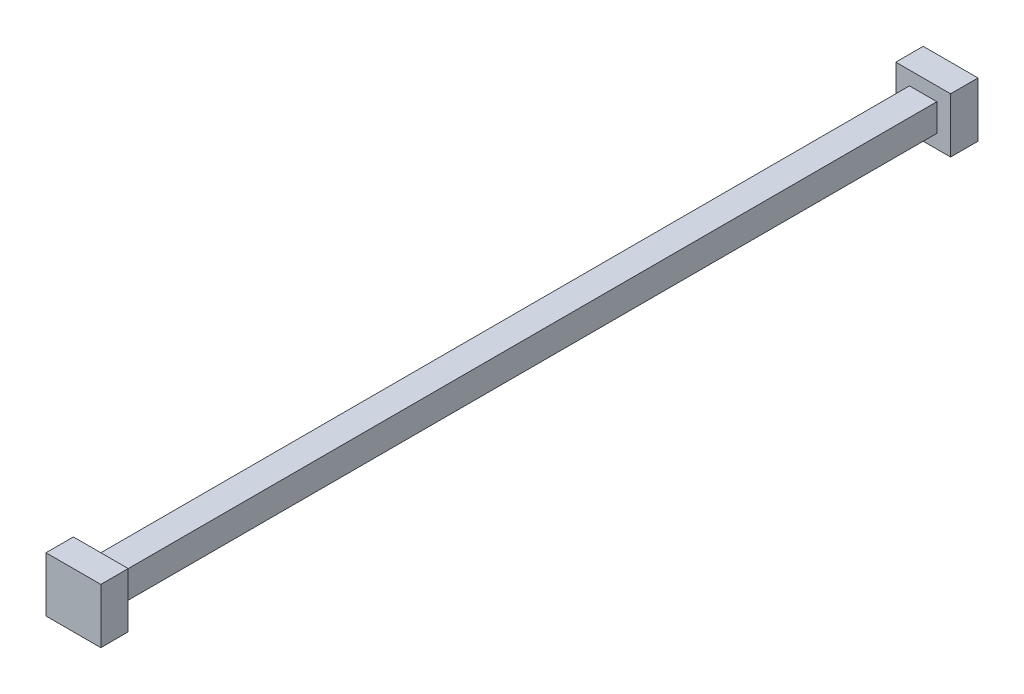
ISO-10303-21;
HEADER;
FILE_DESCRIPTION(('STEP AP214'),'2;1');
FILE_NAME('part.step','',(''),(''),'','','');
FILE_SCHEMA(('AUTOMOTIVE_DESIGN { 1 0 10303 214 1 1 1 1 }'));
ENDSEC;
DATA;
#1=APPLICATION_CONTEXT('core data for automotive mechanical design processes');
#2=APPLICATION_PROTOCOL_DEFINITION('international standard','automotive_design',2000,#1);
#3=PRODUCT_CONTEXT('',#1,'mechanical');
#4=PRODUCT('Part','Part','',(#3));
#5=PRODUCT_RELATED_PRODUCT_CATEGORY('part','',(#4));
#6=PRODUCT_DEFINITION_FORMATION('','',#4);
#7=PRODUCT_DEFINITION_CONTEXT('part definition',#1,'design');
#8=PRODUCT_DEFINITION('design','',#6,#7);
#9=PRODUCT_DEFINITION_SHAPE('','',#8);
#10=(LENGTH_UNIT() NAMED_UNIT(*) SI_UNIT(.MILLI.,.METRE.));
#11=(NAMED_UNIT(*) PLANE_ANGLE_UNIT() SI_UNIT($,.RADIAN.));
#12=(NAMED_UNIT(*) SI_UNIT($,.STERADIAN.) SOLID_ANGLE_UNIT());
#13=UNCERTAINTY_MEASURE_WITH_UNIT(LENGTH_MEASURE(1.E-05),#10,'distance_accuracy_value','');
#14=(GEOMETRIC_REPRESENTATION_CONTEXT(3) GLOBAL_UNCERTAINTY_ASSIGNED_CONTEXT((#13)) GLOBAL_UNIT_ASSIGNED_CONTEXT((#10,
#11,#12)) REPRESENTATION_CONTEXT('',''));
#15=CARTESIAN_POINT('',(0.,0.,0.));
#16=DIRECTION('',(0.,0.,1.));
#17=DIRECTION('',(1.,0.,0.));
#18=AXIS2_PLACEMENT_3D('',#15,#16,#17);
#19=CARTESIAN_POINT('',(5.,-5.,300.));
#20=DIRECTION('',(-1.,0.,0.));
#21=DIRECTION('',(0.,0.,1.));
#22=AXIS2_PLACEMENT_3D('',#19,#20,#21);
#23=PLANE('',#22);
#24=DIRECTION('',(0.,1.,0.));
#25=VECTOR('',#24,1.);
#26=CARTESIAN_POINT('',(5.,-5.,0.));
#27=LINE('',#26,#25);
#28=CARTESIAN_POINT('',(5.,-5.,0.));
#29=VERTEX_POINT('',#28);
#30=CARTESIAN_POINT('',(5.,5.,0.));
#31=VERTEX_POINT('',#30);
#32=EDGE_CURVE('E180',#29,#31,#27,.T.);
#33=ORIENTED_EDGE('',*,*,#32,.T.);
#34=DIRECTION('',(0.,0.,-1.));
#35=VECTOR('',#34,1.);
#36=CARTESIAN_POINT('',(5.,5.,300.));
#37=LINE('',#36,#35);
#38=CARTESIAN_POINT('',(5.,5.,300.));
#39=VERTEX_POINT('',#38);
#40=EDGE_CURVE('E11',#39,#31,#37,.T.);
#41=ORIENTED_EDGE('',*,*,#40,.F.);
#42=DIRECTION('',(0.,1.,0.));
#43=VECTOR('',#42,1.);
#44=CARTESIAN_POINT('',(5.,-5.,300.));
#45=LINE('',#44,#43);
#46=CARTESIAN_POINT('',(5.,-5.,300.));
#47=VERTEX_POINT('',#46);
#48=EDGE_CURVE('E181',#47,#39,#45,.T.);
#49=ORIENTED_EDGE('',*,*,#48,.F.);
#50=DIRECTION('',(0.,0.,-1.));
#51=VECTOR('',#50,1.);
#52=CARTESIAN_POINT('',(5.,-5.,300.));
#53=LINE('',#52,#51);
#54=EDGE_CURVE('E194',#47,#29,#53,.T.);
#55=ORIENTED_EDGE('',*,*,#54,.T.);
#56=EDGE_LOOP('',(#33,#41,#49,#55));
#57=FACE_BOUND('',#56,.T.);
#58=ADVANCED_FACE('F35',(#57),#23,.F.);
#59=CARTESIAN_POINT('',(-5.,5.,300.));
#60=DIRECTION('',(0.,-1.,0.));
#61=DIRECTION('',(0.,0.,-1.));
#62=AXIS2_PLACEMENT_3D('',#59,#60,#61);
#63=PLANE('',#62);
#64=DIRECTION('',(-1.,0.,0.));
#65=VECTOR('',#64,1.);
#66=CARTESIAN_POINT('',(-5.,5.,0.));
#67=LINE('',#66,#65);
#68=CARTESIAN_POINT('',(-5.,5.,0.));
#69=VERTEX_POINT('',#68);
#70=EDGE_CURVE('E197',#31,#69,#67,.T.);
#71=ORIENTED_EDGE('',*,*,#70,.T.);
#72=DIRECTION('',(0.,0.,-1.));
#73=VECTOR('',#72,1.);
#74=CARTESIAN_POINT('',(-5.,5.,300.));
#75=LINE('',#74,#73);
#76=CARTESIAN_POINT('',(-5.,5.,300.));
#77=VERTEX_POINT('',#76);
#78=EDGE_CURVE('E43',#77,#69,#75,.T.);
#79=ORIENTED_EDGE('',*,*,#78,.F.);
#80=DIRECTION('',(-1.,0.,0.));
#81=VECTOR('',#80,1.);
#82=CARTESIAN_POINT('',(-5.,5.,300.));
#83=LINE('',#82,#81);
#84=EDGE_CURVE('E184',#39,#77,#83,.T.);
#85=ORIENTED_EDGE('',*,*,#84,.F.);
#86=ORIENTED_EDGE('',*,*,#40,.T.);
#87=EDGE_LOOP('',(#71,#79,#85,#86));
#88=FACE_BOUND('',#87,.T.);
#89=ADVANCED_FACE('F210',(#88),#63,.F.);
#90=CARTESIAN_POINT('',(-5.,-5.,300.));
#91=DIRECTION('',(1.,0.,0.));
#92=DIRECTION('',(0.,0.,-1.));
#93=AXIS2_PLACEMENT_3D('',#90,#91,#92);
#94=PLANE('',#93);
#95=DIRECTION('',(0.,-1.,0.));
#96=VECTOR('',#95,1.);
#97=CARTESIAN_POINT('',(-5.,-5.,0.));
#98=LINE('',#97,#96);
#99=CARTESIAN_POINT('',(-5.,-5.,0.));
#100=VERTEX_POINT('',#99);
#101=EDGE_CURVE('E200',#69,#100,#98,.T.);
#102=ORIENTED_EDGE('',*,*,#101,.T.);
#103=DIRECTION('',(0.,0.,-1.));
#104=VECTOR('',#103,1.);
#105=CARTESIAN_POINT('',(-5.,-5.,300.));
#106=LINE('',#105,#104);
#107=CARTESIAN_POINT('',(-5.,-5.,300.));
#108=VERTEX_POINT('',#107);
#109=EDGE_CURVE('E50',#108,#100,#106,.T.);
#110=ORIENTED_EDGE('',*,*,#109,.F.);
#111=DIRECTION('',(0.,-1.,0.));
#112=VECTOR('',#111,1.);
#113=CARTESIAN_POINT('',(-5.,-5.,300.));
#114=LINE('',#113,#112);
#115=EDGE_CURVE('E188',#77,#108,#114,.T.);
#116=ORIENTED_EDGE('',*,*,#115,.F.);
#117=ORIENTED_EDGE('',*,*,#78,.T.);
#118=EDGE_LOOP('',(#102,#110,#116,#117));
#119=FACE_BOUND('',#118,.T.);
#120=ADVANCED_FACE('F207',(#119),#94,.F.);
#121=CARTESIAN_POINT('',(-5.,-5.,300.));
#122=DIRECTION('',(0.,1.,0.));
#123=DIRECTION('',(0.,0.,1.));
#124=AXIS2_PLACEMENT_3D('',#121,#122,#123);
#125=PLANE('',#124);
#126=DIRECTION('',(1.,0.,0.));
#127=VECTOR('',#126,1.);
#128=CARTESIAN_POINT('',(-5.,-5.,0.));
#129=LINE('',#128,#127);
#130=EDGE_CURVE('E185',#100,#29,#129,.T.);
#131=ORIENTED_EDGE('',*,*,#130,.T.);
#132=ORIENTED_EDGE('',*,*,#54,.F.);
#133=DIRECTION('',(1.,0.,0.));
#134=VECTOR('',#133,1.);
#135=CARTESIAN_POINT('',(-5.,-5.,300.));
#136=LINE('',#135,#134);
#137=EDGE_CURVE('E191',#108,#47,#136,.T.);
#138=ORIENTED_EDGE('',*,*,#137,.F.);
#139=ORIENTED_EDGE('',*,*,#109,.T.);
#140=EDGE_LOOP('',(#131,#132,#138,#139));
#141=FACE_BOUND('',#140,.T.);
#142=ADVANCED_FACE('F216',(#141),#125,.F.);
#143=CARTESIAN_POINT('',(10.,-10.,310.));
#144=DIRECTION('',(-1.,0.,0.));
#145=DIRECTION('',(0.,0.,1.));
#146=AXIS2_PLACEMENT_3D('',#143,#144,#145);
#147=PLANE('',#146);
#148=DIRECTION('',(0.,1.,0.));
#149=VECTOR('',#148,1.);
#150=CARTESIAN_POINT('',(10.,-10.,300.));
#151=LINE('',#150,#149);
#152=CARTESIAN_POINT('',(10.,-10.,300.));
#153=VERTEX_POINT('',#152);
#154=CARTESIAN_POINT('',(10.,10.,300.));
#155=VERTEX_POINT('',#154);
#156=EDGE_CURVE('E145',#153,#155,#151,.T.);
#157=ORIENTED_EDGE('',*,*,#156,.T.);
#158=DIRECTION('',(0.,0.,-1.));
#159=VECTOR('',#158,1.);
#160=CARTESIAN_POINT('',(10.,10.,310.));
#161=LINE('',#160,#159);
#162=CARTESIAN_POINT('',(10.,10.,310.));
#163=VERTEX_POINT('',#162);
#164=EDGE_CURVE('E177',#163,#155,#161,.T.);
#165=ORIENTED_EDGE('',*,*,#164,.F.);
#166=DIRECTION('',(0.,1.,0.));
#167=VECTOR('',#166,1.);
#168=CARTESIAN_POINT('',(10.,-10.,310.));
#169=LINE('',#168,#167);
#170=CARTESIAN_POINT('',(10.,-10.,310.));
#171=VERTEX_POINT('',#170);
#172=EDGE_CURVE('E154',#171,#163,#169,.T.);
#173=ORIENTED_EDGE('',*,*,#172,.F.);
#174=DIRECTION('',(0.,0.,-1.));
#175=VECTOR('',#174,1.);
#176=CARTESIAN_POINT('',(10.,-10.,310.));
#177=LINE('',#176,#175);
#178=EDGE_CURVE('E163',#171,#153,#177,.T.);
#179=ORIENTED_EDGE('',*,*,#178,.T.);
#180=EDGE_LOOP('',(#157,#165,#173,#179));
#181=FACE_BOUND('',#180,.T.);
#182=ADVANCED_FACE('F229',(#181),#147,.F.);
#183=CARTESIAN_POINT('',(-10.,10.,310.));
#184=DIRECTION('',(0.,-1.,0.));
#185=DIRECTION('',(0.,0.,-1.));
#186=AXIS2_PLACEMENT_3D('',#183,#184,#185);
#187=PLANE('',#186);
#188=DIRECTION('',(-1.,0.,0.));
#189=VECTOR('',#188,1.);
#190=CARTESIAN_POINT('',(-10.,10.,300.));
#191=LINE('',#190,#189);
#192=CARTESIAN_POINT('',(-10.,10.,300.));
#193=VERTEX_POINT('',#192);
#194=EDGE_CURVE('E148',#155,#193,#191,.T.);
#195=ORIENTED_EDGE('',*,*,#194,.T.);
#196=DIRECTION('',(0.,0.,-1.));
#197=VECTOR('',#196,1.);
#198=CARTESIAN_POINT('',(-10.,10.,310.));
#199=LINE('',#198,#197);
#200=CARTESIAN_POINT('',(-10.,10.,310.));
#201=VERTEX_POINT('',#200);
#202=EDGE_CURVE('E174',#201,#193,#199,.T.);
#203=ORIENTED_EDGE('',*,*,#202,.F.);
#204=DIRECTION('',(-1.,0.,0.));
#205=VECTOR('',#204,1.);
#206=CARTESIAN_POINT('',(-10.,10.,310.));
#207=LINE('',#206,#205);
#208=EDGE_CURVE('E157',#163,#201,#207,.T.);
#209=ORIENTED_EDGE('',*,*,#208,.F.);
#210=ORIENTED_EDGE('',*,*,#164,.T.);
#211=EDGE_LOOP('',(#195,#203,#209,#210));
#212=FACE_BOUND('',#211,.T.);
#213=ADVANCED_FACE('F241',(#212),#187,.F.);
#214=CARTESIAN_POINT('',(-10.,-10.,310.));
#215=DIRECTION('',(1.,0.,0.));
#216=DIRECTION('',(0.,0.,-1.));
#217=AXIS2_PLACEMENT_3D('',#214,#215,#216);
#218=PLANE('',#217);
#219=DIRECTION('',(0.,-1.,0.));
#220=VECTOR('',#219,1.);
#221=CARTESIAN_POINT('',(-10.,-10.,300.));
#222=LINE('',#221,#220);
#223=CARTESIAN_POINT('',(-10.,-10.,300.));
#224=VERTEX_POINT('',#223);
#225=EDGE_CURVE('E166',#193,#224,#222,.T.);
#226=ORIENTED_EDGE('',*,*,#225,.T.);
#227=DIRECTION('',(0.,0.,-1.));
#228=VECTOR('',#227,1.);
#229=CARTESIAN_POINT('',(-10.,-10.,310.));
#230=LINE('',#229,#228);
#231=CARTESIAN_POINT('',(-10.,-10.,310.));
#232=VERTEX_POINT('',#231);
#233=EDGE_CURVE('E171',#232,#224,#230,.T.);
#234=ORIENTED_EDGE('',*,*,#233,.F.);
#235=DIRECTION('',(0.,-1.,0.));
#236=VECTOR('',#235,1.);
#237=CARTESIAN_POINT('',(-10.,-10.,310.));
#238=LINE('',#237,#236);
#239=EDGE_CURVE('E160',#201,#232,#238,.T.);
#240=ORIENTED_EDGE('',*,*,#239,.F.);
#241=ORIENTED_EDGE('',*,*,#202,.T.);
#242=EDGE_LOOP('',(#226,#234,#240,#241));
#243=FACE_BOUND('',#242,.T.);
#244=ADVANCED_FACE('F238',(#243),#218,.F.);
#245=CARTESIAN_POINT('',(-10.,-10.,310.));
#246=DIRECTION('',(0.,1.,0.));
#247=DIRECTION('',(0.,0.,1.));
#248=AXIS2_PLACEMENT_3D('',#245,#246,#247);
#249=PLANE('',#248);
#250=DIRECTION('',(1.,0.,0.));
#251=VECTOR('',#250,1.);
#252=CARTESIAN_POINT('',(-10.,-10.,300.));
#253=LINE('',#252,#251);
#254=EDGE_CURVE('E158',#224,#153,#253,.T.);
#255=ORIENTED_EDGE('',*,*,#254,.T.);
#256=ORIENTED_EDGE('',*,*,#178,.F.);
#257=DIRECTION('',(1.,0.,0.));
#258=VECTOR('',#257,1.);
#259=CARTESIAN_POINT('',(-10.,-10.,310.));
#260=LINE('',#259,#258);
#261=EDGE_CURVE('E162',#232,#171,#260,.T.);
#262=ORIENTED_EDGE('',*,*,#261,.F.);
#263=ORIENTED_EDGE('',*,*,#233,.T.);
#264=EDGE_LOOP('',(#255,#256,#262,#263));
#265=FACE_BOUND('',#264,.T.);
#266=ADVANCED_FACE('F234',(#265),#249,.F.);
#267=CARTESIAN_POINT('',(0.,0.,310.));
#268=DIRECTION('',(0.,0.,-1.));
#269=DIRECTION('',(-1.,0.,0.));
#270=AXIS2_PLACEMENT_3D('',#267,#268,#269);
#271=PLANE('',#270);
#272=ORIENTED_EDGE('',*,*,#172,.T.);
#273=ORIENTED_EDGE('',*,*,#208,.T.);
#274=ORIENTED_EDGE('',*,*,#239,.T.);
#275=ORIENTED_EDGE('',*,*,#261,.T.);
#276=EDGE_LOOP('',(#272,#273,#274,#275));
#277=FACE_BOUND('',#276,.T.);
#278=ADVANCED_FACE('F222',(#277),#271,.F.);
#279=CARTESIAN_POINT('',(0.,0.,300.));
#280=DIRECTION('',(0.,0.,-1.));
#281=DIRECTION('',(-1.,0.,0.));
#282=AXIS2_PLACEMENT_3D('',#279,#280,#281);
#283=PLANE('',#282);
#284=ORIENTED_EDGE('',*,*,#137,.T.);
#285=ORIENTED_EDGE('',*,*,#48,.T.);
#286=ORIENTED_EDGE('',*,*,#84,.T.);
#287=ORIENTED_EDGE('',*,*,#115,.T.);
#288=EDGE_LOOP('',(#284,#285,#286,#287));
#289=FACE_BOUND('',#288,.T.);
#290=ORIENTED_EDGE('',*,*,#156,.F.);
#291=ORIENTED_EDGE('',*,*,#254,.F.);
#292=ORIENTED_EDGE('',*,*,#225,.F.);
#293=ORIENTED_EDGE('',*,*,#194,.F.);
#294=EDGE_LOOP('',(#290,#291,#292,#293));
#295=FACE_BOUND('',#294,.T.);
#296=ADVANCED_FACE('F219',(#289,#295),#283,.T.);
#297=CARTESIAN_POINT('',(0.,0.,0.));
#298=DIRECTION('',(0.,0.,1.));
#299=DIRECTION('',(1.,0.,0.));
#300=AXIS2_PLACEMENT_3D('',#297,#298,#299);
#301=PLANE('',#300);
#302=DIRECTION('',(0.,1.,0.));
#303=VECTOR('',#302,1.);
#304=CARTESIAN_POINT('',(-10.,-10.,0.));
#305=LINE('',#304,#303);
#306=CARTESIAN_POINT('',(-10.,-10.,0.));
#307=VERTEX_POINT('',#306);
#308=CARTESIAN_POINT('',(-10.,10.,0.));
#309=VERTEX_POINT('',#308);
#310=EDGE_CURVE('E144',#307,#309,#305,.T.);
#311=ORIENTED_EDGE('',*,*,#310,.F.);
#312=DIRECTION('',(-1.,0.,0.));
#313=VECTOR('',#312,1.);
#314=CARTESIAN_POINT('',(10.,-10.,0.));
#315=LINE('',#314,#313);
#316=CARTESIAN_POINT('',(10.,-10.,0.));
#317=VERTEX_POINT('',#316);
#318=EDGE_CURVE('E140',#317,#307,#315,.T.);
#319=ORIENTED_EDGE('',*,*,#318,.F.);
#320=DIRECTION('',(0.,-1.,0.));
#321=VECTOR('',#320,1.);
#322=CARTESIAN_POINT('',(10.,-10.,0.));
#323=LINE('',#322,#321);
#324=CARTESIAN_POINT('',(10.,10.,0.));
#325=VERTEX_POINT('',#324);
#326=EDGE_CURVE('E366',#325,#317,#323,.T.);
#327=ORIENTED_EDGE('',*,*,#326,.F.);
#328=DIRECTION('',(1.,0.,0.));
#329=VECTOR('',#328,1.);
#330=CARTESIAN_POINT('',(10.,10.,0.));
#331=LINE('',#330,#329);
#332=EDGE_CURVE('E369',#309,#325,#331,.T.);
#333=ORIENTED_EDGE('',*,*,#332,.F.);
#334=EDGE_LOOP('',(#311,#319,#327,#333));
#335=FACE_BOUND('',#334,.T.);
#336=ORIENTED_EDGE('',*,*,#32,.F.);
#337=ORIENTED_EDGE('',*,*,#130,.F.);
#338=ORIENTED_EDGE('',*,*,#101,.F.);
#339=ORIENTED_EDGE('',*,*,#70,.F.);
#340=EDGE_LOOP('',(#336,#337,#338,#339));
#341=FACE_BOUND('',#340,.T.);
#342=ADVANCED_FACE('F213',(#335,#341),#301,.T.);
#343=CARTESIAN_POINT('',(-10.,-10.,-10.));
#344=DIRECTION('',(1.,0.,0.));
#345=DIRECTION('',(0.,0.,-1.));
#346=AXIS2_PLACEMENT_3D('',#343,#344,#345);
#347=PLANE('',#346);
#348=ORIENTED_EDGE('',*,*,#310,.T.);
#349=DIRECTION('',(0.,0.,1.));
#350=VECTOR('',#349,1.);
#351=CARTESIAN_POINT('',(-10.,10.,-10.));
#352=LINE('',#351,#350);
#353=CARTESIAN_POINT('',(-10.,10.,-10.));
#354=VERTEX_POINT('',#353);
#355=EDGE_CURVE('E124',#354,#309,#352,.T.);
#356=ORIENTED_EDGE('',*,*,#355,.F.);
#357=DIRECTION('',(0.,1.,0.));
#358=VECTOR('',#357,1.);
#359=CARTESIAN_POINT('',(-10.,-10.,-10.));
#360=LINE('',#359,#358);
#361=CARTESIAN_POINT('',(-10.,-10.,-10.));
#362=VERTEX_POINT('',#361);
#363=EDGE_CURVE('E131',#362,#354,#360,.T.);
#364=ORIENTED_EDGE('',*,*,#363,.F.);
#365=DIRECTION('',(0.,0.,1.));
#366=VECTOR('',#365,1.);
#367=CARTESIAN_POINT('',(-10.,-10.,-10.));
#368=LINE('',#367,#366);
#369=EDGE_CURVE('E363',#362,#307,#368,.T.);
#370=ORIENTED_EDGE('',*,*,#369,.T.);
#371=EDGE_LOOP('',(#348,#356,#364,#370));
#372=FACE_BOUND('',#371,.T.);
#373=ADVANCED_FACE('F142',(#372),#347,.F.);
#374=CARTESIAN_POINT('',(10.,10.,-10.));
#375=DIRECTION('',(0.,-1.,0.));
#376=DIRECTION('',(0.,0.,-1.));
#377=AXIS2_PLACEMENT_3D('',#374,#375,#376);
#378=PLANE('',#377);
#379=ORIENTED_EDGE('',*,*,#332,.T.);
#380=DIRECTION('',(0.,0.,1.));
#381=VECTOR('',#380,1.);
#382=CARTESIAN_POINT('',(10.,10.,-10.));
#383=LINE('',#382,#381);
#384=CARTESIAN_POINT('',(10.,10.,-10.));
#385=VERTEX_POINT('',#384);
#386=EDGE_CURVE('E127',#385,#325,#383,.T.);
#387=ORIENTED_EDGE('',*,*,#386,.F.);
#388=DIRECTION('',(1.,0.,0.));
#389=VECTOR('',#388,1.);
#390=CARTESIAN_POINT('',(10.,10.,-10.));
#391=LINE('',#390,#389);
#392=EDGE_CURVE('E120',#354,#385,#391,.T.);
#393=ORIENTED_EDGE('',*,*,#392,.F.);
#394=ORIENTED_EDGE('',*,*,#355,.T.);
#395=EDGE_LOOP('',(#379,#387,#393,#394));
#396=FACE_BOUND('',#395,.T.);
#397=ADVANCED_FACE('F122',(#396),#378,.F.);
#398=CARTESIAN_POINT('',(10.,-10.,-10.));
#399=DIRECTION('',(-1.,0.,0.));
#400=DIRECTION('',(0.,0.,1.));
#401=AXIS2_PLACEMENT_3D('',#398,#399,#400);
#402=PLANE('',#401);
#403=ORIENTED_EDGE('',*,*,#326,.T.);
#404=DIRECTION('',(0.,0.,1.));
#405=VECTOR('',#404,1.);
#406=CARTESIAN_POINT('',(10.,-10.,-10.));
#407=LINE('',#406,#405);
#408=CARTESIAN_POINT('',(10.,-10.,-10.));
#409=VERTEX_POINT('',#408);
#410=EDGE_CURVE('E150',#409,#317,#407,.T.);
#411=ORIENTED_EDGE('',*,*,#410,.F.);
#412=DIRECTION('',(0.,-1.,0.));
#413=VECTOR('',#412,1.);
#414=CARTESIAN_POINT('',(10.,-10.,-10.));
#415=LINE('',#414,#413);
#416=EDGE_CURVE('E130',#385,#409,#415,.T.);
#417=ORIENTED_EDGE('',*,*,#416,.F.);
#418=ORIENTED_EDGE('',*,*,#386,.T.);
#419=EDGE_LOOP('',(#403,#411,#417,#418));
#420=FACE_BOUND('',#419,.T.);
#421=ADVANCED_FACE('F330',(#420),#402,.F.);
#422=CARTESIAN_POINT('',(10.,-10.,-10.));
#423=DIRECTION('',(0.,1.,0.));
#424=DIRECTION('',(0.,0.,1.));
#425=AXIS2_PLACEMENT_3D('',#422,#423,#424);
#426=PLANE('',#425);
#427=ORIENTED_EDGE('',*,*,#318,.T.);
#428=ORIENTED_EDGE('',*,*,#369,.F.);
#429=DIRECTION('',(-1.,0.,0.));
#430=VECTOR('',#429,1.);
#431=CARTESIAN_POINT('',(10.,-10.,-10.));
#432=LINE('',#431,#430);
#433=EDGE_CURVE('E136',#409,#362,#432,.T.);
#434=ORIENTED_EDGE('',*,*,#433,.F.);
#435=ORIENTED_EDGE('',*,*,#410,.T.);
#436=EDGE_LOOP('',(#427,#428,#434,#435));
#437=FACE_BOUND('',#436,.T.);
#438=ADVANCED_FACE('F339',(#437),#426,.F.);
#439=CARTESIAN_POINT('',(0.,0.,-10.));
#440=DIRECTION('',(0.,0.,1.));
#441=DIRECTION('',(1.,0.,0.));
#442=AXIS2_PLACEMENT_3D('',#439,#440,#441);
#443=PLANE('',#442);
#444=ORIENTED_EDGE('',*,*,#363,.T.);
#445=ORIENTED_EDGE('',*,*,#392,.T.);
#446=ORIENTED_EDGE('',*,*,#416,.T.);
#447=ORIENTED_EDGE('',*,*,#433,.T.);
#448=EDGE_LOOP('',(#444,#445,#446,#447));
#449=FACE_BOUND('',#448,.T.);
#450=ADVANCED_FACE('F134',(#449),#443,.F.);
#451=CLOSED_SHELL('',(#58,#89,#120,#142,#182,#213,#244,#266,#278,#296,#342,#373,#397,#421,#438,#450));
#452=MANIFOLD_SOLID_BREP('B2',#451);
#453=ADVANCED_BREP_SHAPE_REPRESENTATION('',(#18,#452),#14);
#454=SHAPE_DEFINITION_REPRESENTATION(#9,#453);
ENDSEC;
END-ISO-10303-21;
